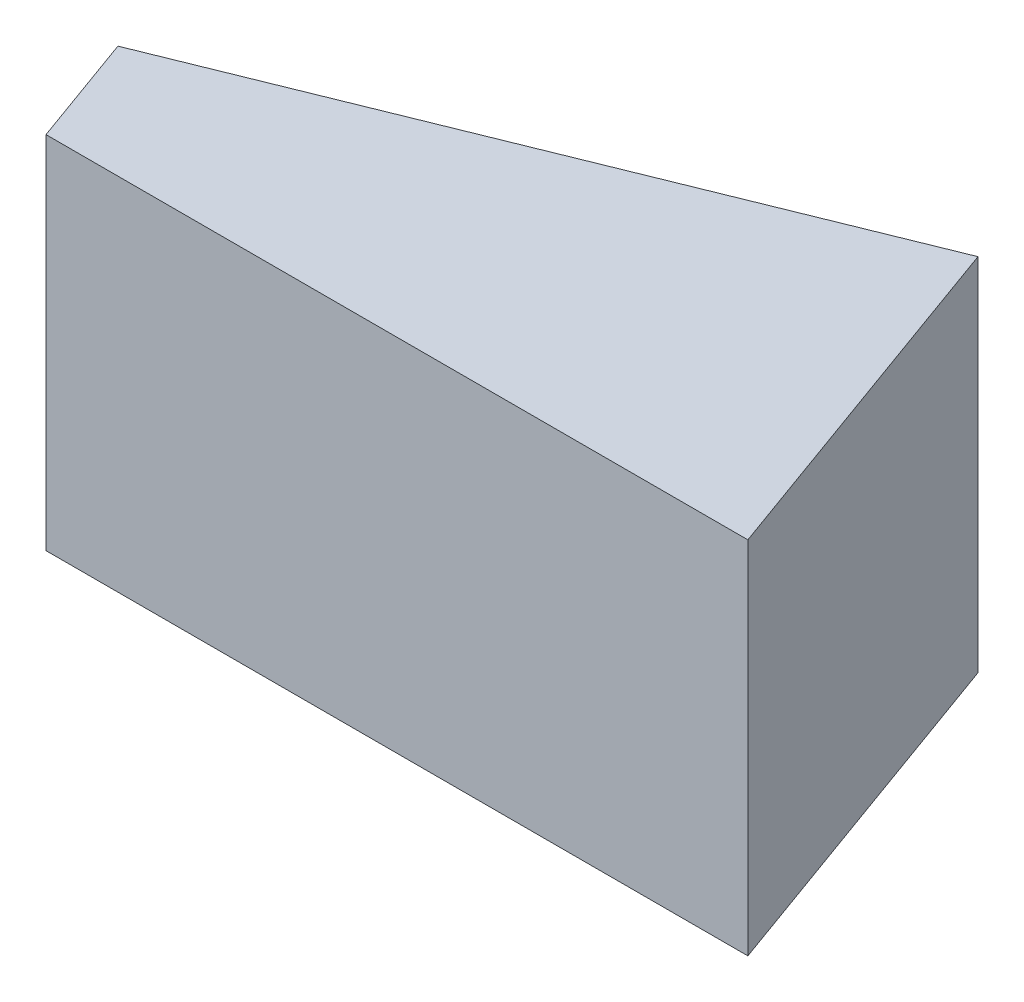
ISO-10303-21;
HEADER;
FILE_DESCRIPTION(('STEP AP214'),'2;1');
FILE_NAME('part.step','',(''),(''),'','','');
FILE_SCHEMA(('AUTOMOTIVE_DESIGN { 1 0 10303 214 1 1 1 1 }'));
ENDSEC;
DATA;
#1=APPLICATION_CONTEXT('core data for automotive mechanical design processes');
#2=APPLICATION_PROTOCOL_DEFINITION('international standard','automotive_design',2000,#1);
#3=PRODUCT_CONTEXT('',#1,'mechanical');
#4=PRODUCT('Part','Part','',(#3));
#5=PRODUCT_RELATED_PRODUCT_CATEGORY('part','',(#4));
#6=PRODUCT_DEFINITION_FORMATION('','',#4);
#7=PRODUCT_DEFINITION_CONTEXT('part definition',#1,'design');
#8=PRODUCT_DEFINITION('design','',#6,#7);
#9=PRODUCT_DEFINITION_SHAPE('','',#8);
#10=(LENGTH_UNIT() NAMED_UNIT(*) SI_UNIT(.MILLI.,.METRE.));
#11=(NAMED_UNIT(*) PLANE_ANGLE_UNIT() SI_UNIT($,.RADIAN.));
#12=(NAMED_UNIT(*) SI_UNIT($,.STERADIAN.) SOLID_ANGLE_UNIT());
#13=UNCERTAINTY_MEASURE_WITH_UNIT(LENGTH_MEASURE(1.E-05),#10,'distance_accuracy_value','');
#14=(GEOMETRIC_REPRESENTATION_CONTEXT(3) GLOBAL_UNCERTAINTY_ASSIGNED_CONTEXT((#13)) GLOBAL_UNIT_ASSIGNED_CONTEXT((#10,
#11,#12)) REPRESENTATION_CONTEXT('',''));
#15=CARTESIAN_POINT('',(0.,0.,0.));
#16=DIRECTION('',(0.,0.,1.));
#17=DIRECTION('',(1.,0.,0.));
#18=AXIS2_PLACEMENT_3D('',#15,#16,#17);
#19=CARTESIAN_POINT('',(0.,38.1,0.));
#20=DIRECTION('',(0.,0.,-1.));
#21=DIRECTION('',(-1.,0.,0.));
#22=AXIS2_PLACEMENT_3D('',#19,#20,#21);
#23=PLANE('',#22);
#24=DIRECTION('',(1.,0.,0.));
#25=VECTOR('',#24,1.);
#26=CARTESIAN_POINT('',(0.,0.,0.));
#27=LINE('',#26,#25);
#28=CARTESIAN_POINT('',(33.734375,0.,0.));
#29=VERTEX_POINT('',#28);
#30=CARTESIAN_POINT('',(107.95,0.,0.));
#31=VERTEX_POINT('',#30);
#32=EDGE_CURVE('E121',#29,#31,#27,.T.);
#33=ORIENTED_EDGE('',*,*,#32,.T.);
#34=DIRECTION('',(0.,-1.,0.));
#35=VECTOR('',#34,1.);
#36=CARTESIAN_POINT('',(107.95,38.1,0.));
#37=LINE('',#36,#35);
#38=CARTESIAN_POINT('',(107.95,38.1,0.));
#39=VERTEX_POINT('',#38);
#40=EDGE_CURVE('E11',#39,#31,#37,.T.);
#41=ORIENTED_EDGE('',*,*,#40,.F.);
#42=DIRECTION('',(1.,0.,0.));
#43=VECTOR('',#42,1.);
#44=CARTESIAN_POINT('',(0.,38.1,0.));
#45=LINE('',#44,#43);
#46=CARTESIAN_POINT('',(33.734375,38.1,0.));
#47=VERTEX_POINT('',#46);
#48=EDGE_CURVE('E105',#47,#39,#45,.T.);
#49=ORIENTED_EDGE('',*,*,#48,.F.);
#50=DIRECTION('',(0.,-1.,0.));
#51=VECTOR('',#50,1.);
#52=CARTESIAN_POINT('',(33.734375,38.1,0.));
#53=LINE('',#52,#51);
#54=EDGE_CURVE('E117',#47,#29,#53,.T.);
#55=ORIENTED_EDGE('',*,*,#54,.T.);
#56=EDGE_LOOP('',(#33,#41,#49,#55));
#57=FACE_BOUND('',#56,.T.);
#58=ADVANCED_FACE('F45',(#57),#23,.F.);
#59=CARTESIAN_POINT('',(95.4875419299258,38.1,-34.4965141357233));
#60=DIRECTION('',(-0.940507002755337,0.,0.339774304161119));
#61=DIRECTION('',(0.339774304161119,0.,0.940507002755337));
#62=AXIS2_PLACEMENT_3D('',#59,#60,#61);
#63=PLANE('',#62);
#64=DIRECTION('',(-0.339774304161119,0.,-0.940507002755337));
#65=VECTOR('',#64,1.);
#66=CARTESIAN_POINT('',(95.4875419299258,0.,-34.4965141357233));
#67=LINE('',#66,#65);
#68=CARTESIAN_POINT('',(94.1857207861149,0.,-38.1));
#69=VERTEX_POINT('',#68);
#70=EDGE_CURVE('E110',#31,#69,#67,.T.);
#71=ORIENTED_EDGE('',*,*,#70,.T.);
#72=DIRECTION('',(0.,-1.,0.));
#73=VECTOR('',#72,1.);
#74=CARTESIAN_POINT('',(94.1857207861149,38.1,-38.1));
#75=LINE('',#74,#73);
#76=CARTESIAN_POINT('',(94.1857207861149,38.1,-38.1));
#77=VERTEX_POINT('',#76);
#78=EDGE_CURVE('E54',#77,#69,#75,.T.);
#79=ORIENTED_EDGE('',*,*,#78,.F.);
#80=DIRECTION('',(-0.339774304161119,0.,-0.940507002755337));
#81=VECTOR('',#80,1.);
#82=CARTESIAN_POINT('',(95.4875419299258,38.1,-34.4965141357233));
#83=LINE('',#82,#81);
#84=EDGE_CURVE('E100',#39,#77,#83,.T.);
#85=ORIENTED_EDGE('',*,*,#84,.F.);
#86=ORIENTED_EDGE('',*,*,#40,.T.);
#87=EDGE_LOOP('',(#71,#79,#85,#86));
#88=FACE_BOUND('',#87,.T.);
#89=ADVANCED_FACE('F109',(#88),#63,.F.);
#90=CARTESIAN_POINT('',(0.,38.1,0.));
#91=DIRECTION('',(0.375,0.,0.927024810886958));
#92=DIRECTION('',(0.927024810886958,0.,-0.375));
#93=AXIS2_PLACEMENT_3D('',#90,#91,#92);
#94=PLANE('',#93);
#95=DIRECTION('',(-0.927024810886958,0.,0.375));
#96=VECTOR('',#95,1.);
#97=CARTESIAN_POINT('',(0.,0.,0.));
#98=LINE('',#97,#96);
#99=CARTESIAN_POINT('',(29.4330377456609,0.,-11.90625));
#100=VERTEX_POINT('',#99);
#101=EDGE_CURVE('E85',#69,#100,#98,.T.);
#102=ORIENTED_EDGE('',*,*,#101,.T.);
#103=DIRECTION('',(0.,-1.,0.));
#104=VECTOR('',#103,1.);
#105=CARTESIAN_POINT('',(29.4330377456609,38.1,-11.90625));
#106=LINE('',#105,#104);
#107=CARTESIAN_POINT('',(29.4330377456609,38.1,-11.90625));
#108=VERTEX_POINT('',#107);
#109=EDGE_CURVE('E112',#108,#100,#106,.T.);
#110=ORIENTED_EDGE('',*,*,#109,.F.);
#111=DIRECTION('',(-0.927024810886958,0.,0.375));
#112=VECTOR('',#111,1.);
#113=CARTESIAN_POINT('',(0.,38.1,0.));
#114=LINE('',#113,#112);
#115=EDGE_CURVE('E103',#77,#108,#114,.T.);
#116=ORIENTED_EDGE('',*,*,#115,.F.);
#117=ORIENTED_EDGE('',*,*,#78,.T.);
#118=EDGE_LOOP('',(#102,#110,#116,#117));
#119=FACE_BOUND('',#118,.T.);
#120=ADVANCED_FACE('F113',(#119),#94,.F.);
#121=CARTESIAN_POINT('',(29.8398568531018,38.1,-10.7801606674135));
#122=DIRECTION('',(0.940507002755337,0.,-0.339774304161119));
#123=DIRECTION('',(-0.339774304161119,0.,-0.940507002755337));
#124=AXIS2_PLACEMENT_3D('',#121,#122,#123);
#125=PLANE('',#124);
#126=DIRECTION('',(0.339774304161119,0.,0.940507002755337));
#127=VECTOR('',#126,1.);
#128=CARTESIAN_POINT('',(29.8398568531018,0.,-10.7801606674135));
#129=LINE('',#128,#127);
#130=EDGE_CURVE('E91',#100,#29,#129,.T.);
#131=ORIENTED_EDGE('',*,*,#130,.T.);
#132=ORIENTED_EDGE('',*,*,#54,.F.);
#133=DIRECTION('',(0.339774304161119,0.,0.940507002755337));
#134=VECTOR('',#133,1.);
#135=CARTESIAN_POINT('',(29.8398568531018,38.1,-10.7801606674135));
#136=LINE('',#135,#134);
#137=EDGE_CURVE('E64',#108,#47,#136,.T.);
#138=ORIENTED_EDGE('',*,*,#137,.F.);
#139=ORIENTED_EDGE('',*,*,#109,.T.);
#140=EDGE_LOOP('',(#131,#132,#138,#139));
#141=FACE_BOUND('',#140,.T.);
#142=ADVANCED_FACE('F134',(#141),#125,.F.);
#143=CARTESIAN_POINT('',(0.,38.1,0.));
#144=DIRECTION('',(0.,1.,0.));
#145=DIRECTION('',(0.,0.,1.));
#146=AXIS2_PLACEMENT_3D('',#143,#144,#145);
#147=PLANE('',#146);
#148=ORIENTED_EDGE('',*,*,#48,.T.);
#149=ORIENTED_EDGE('',*,*,#84,.T.);
#150=ORIENTED_EDGE('',*,*,#115,.T.);
#151=ORIENTED_EDGE('',*,*,#137,.T.);
#152=EDGE_LOOP('',(#148,#149,#150,#151));
#153=FACE_BOUND('',#152,.T.);
#154=ADVANCED_FACE('F101',(#153),#147,.T.);
#155=CARTESIAN_POINT('',(0.,0.,0.));
#156=DIRECTION('',(0.,1.,0.));
#157=DIRECTION('',(0.,0.,1.));
#158=AXIS2_PLACEMENT_3D('',#155,#156,#157);
#159=PLANE('',#158);
#160=ORIENTED_EDGE('',*,*,#32,.F.);
#161=ORIENTED_EDGE('',*,*,#130,.F.);
#162=ORIENTED_EDGE('',*,*,#101,.F.);
#163=ORIENTED_EDGE('',*,*,#70,.F.);
#164=EDGE_LOOP('',(#160,#161,#162,#163));
#165=FACE_BOUND('',#164,.T.);
#166=ADVANCED_FACE('F137',(#165),#159,.F.);
#167=CLOSED_SHELL('',(#58,#89,#120,#142,#154,#166));
#168=MANIFOLD_SOLID_BREP('B2',#167);
#169=ADVANCED_BREP_SHAPE_REPRESENTATION('',(#18,#168),#14);
#170=SHAPE_DEFINITION_REPRESENTATION(#9,#169);
ENDSEC;
END-ISO-10303-21;
